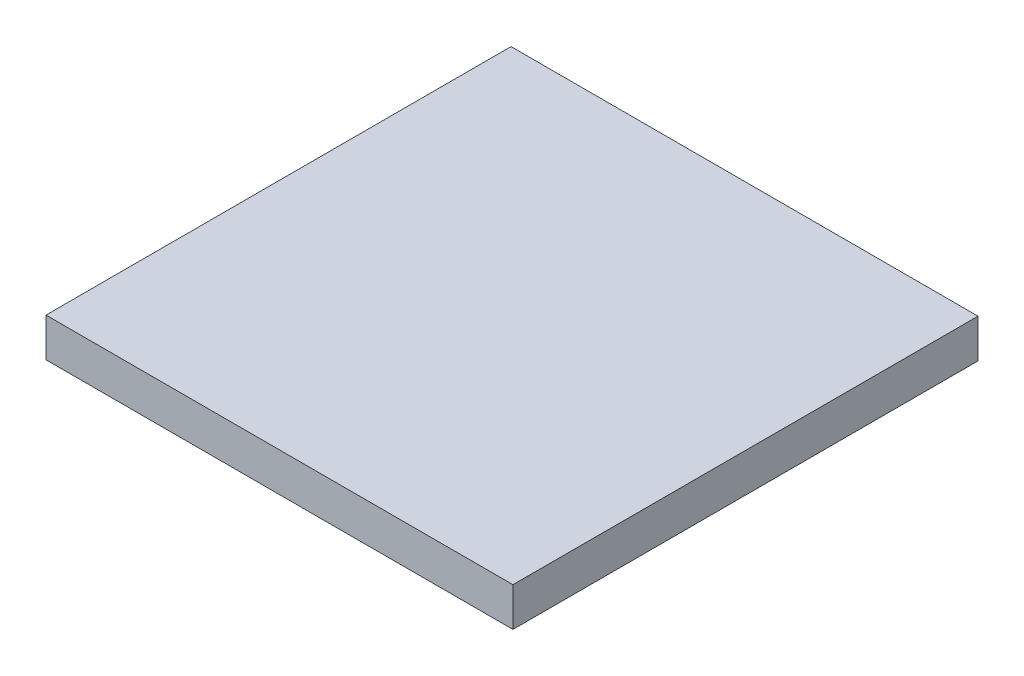
ISO-10303-21;
HEADER;
FILE_DESCRIPTION(('STEP AP214'),'2;1');
FILE_NAME('part.step','',(''),(''),'','','');
FILE_SCHEMA(('AUTOMOTIVE_DESIGN { 1 0 10303 214 1 1 1 1 }'));
ENDSEC;
DATA;
#1=APPLICATION_CONTEXT('core data for automotive mechanical design processes');
#2=APPLICATION_PROTOCOL_DEFINITION('international standard','automotive_design',2000,#1);
#3=PRODUCT_CONTEXT('',#1,'mechanical');
#4=PRODUCT('Part','Part','',(#3));
#5=PRODUCT_RELATED_PRODUCT_CATEGORY('part','',(#4));
#6=PRODUCT_DEFINITION_FORMATION('','',#4);
#7=PRODUCT_DEFINITION_CONTEXT('part definition',#1,'design');
#8=PRODUCT_DEFINITION('design','',#6,#7);
#9=PRODUCT_DEFINITION_SHAPE('','',#8);
#10=(LENGTH_UNIT() NAMED_UNIT(*) SI_UNIT(.MILLI.,.METRE.));
#11=(NAMED_UNIT(*) PLANE_ANGLE_UNIT() SI_UNIT($,.RADIAN.));
#12=(NAMED_UNIT(*) SI_UNIT($,.STERADIAN.) SOLID_ANGLE_UNIT());
#13=UNCERTAINTY_MEASURE_WITH_UNIT(LENGTH_MEASURE(1.E-05),#10,'distance_accuracy_value','');
#14=(GEOMETRIC_REPRESENTATION_CONTEXT(3) GLOBAL_UNCERTAINTY_ASSIGNED_CONTEXT((#13)) GLOBAL_UNIT_ASSIGNED_CONTEXT((#10,
#11,#12)) REPRESENTATION_CONTEXT('',''));
#15=CARTESIAN_POINT('',(0.,0.,0.));
#16=DIRECTION('',(0.,0.,1.));
#17=DIRECTION('',(1.,0.,0.));
#18=AXIS2_PLACEMENT_3D('',#15,#16,#17);
#19=CARTESIAN_POINT('',(153.02484,-12.7,-304.8));
#20=DIRECTION('',(1.,0.,0.));
#21=DIRECTION('',(0.,0.,-1.));
#22=AXIS2_PLACEMENT_3D('',#19,#20,#21);
#23=PLANE('',#22);
#24=DIRECTION('',(0.,1.,0.));
#25=VECTOR('',#24,1.);
#26=CARTESIAN_POINT('',(153.02484,-12.7,0.));
#27=LINE('',#26,#25);
#28=CARTESIAN_POINT('',(153.02484,-12.7,0.));
#29=VERTEX_POINT('',#28);
#30=CARTESIAN_POINT('',(153.02484,12.7,0.));
#31=VERTEX_POINT('',#30);
#32=EDGE_CURVE('E105',#29,#31,#27,.T.);
#33=ORIENTED_EDGE('',*,*,#32,.F.);
#34=DIRECTION('',(0.,0.,1.));
#35=VECTOR('',#34,1.);
#36=CARTESIAN_POINT('',(153.02484,-12.7,-304.8));
#37=LINE('',#36,#35);
#38=CARTESIAN_POINT('',(153.02484,-12.7,-304.8));
#39=VERTEX_POINT('',#38);
#40=EDGE_CURVE('E11',#39,#29,#37,.T.);
#41=ORIENTED_EDGE('',*,*,#40,.F.);
#42=DIRECTION('',(0.,1.,0.));
#43=VECTOR('',#42,1.);
#44=CARTESIAN_POINT('',(153.02484,-12.7,-304.8));
#45=LINE('',#44,#43);
#46=CARTESIAN_POINT('',(153.02484,12.7,-304.8));
#47=VERTEX_POINT('',#46);
#48=EDGE_CURVE('E99',#39,#47,#45,.T.);
#49=ORIENTED_EDGE('',*,*,#48,.T.);
#50=DIRECTION('',(0.,0.,1.));
#51=VECTOR('',#50,1.);
#52=CARTESIAN_POINT('',(153.02484,12.7,-304.8));
#53=LINE('',#52,#51);
#54=EDGE_CURVE('E44',#47,#31,#53,.T.);
#55=ORIENTED_EDGE('',*,*,#54,.T.);
#56=EDGE_LOOP('',(#33,#41,#49,#55));
#57=FACE_BOUND('',#56,.T.);
#58=ADVANCED_FACE('F41',(#57),#23,.T.);
#59=CARTESIAN_POINT('',(-153.02484,-12.7,-304.8));
#60=DIRECTION('',(0.,-1.,0.));
#61=DIRECTION('',(0.,0.,-1.));
#62=AXIS2_PLACEMENT_3D('',#59,#60,#61);
#63=PLANE('',#62);
#64=DIRECTION('',(1.,0.,0.));
#65=VECTOR('',#64,1.);
#66=CARTESIAN_POINT('',(-153.02484,-12.7,0.));
#67=LINE('',#66,#65);
#68=CARTESIAN_POINT('',(-153.02484,-12.7,0.));
#69=VERTEX_POINT('',#68);
#70=EDGE_CURVE('E101',#69,#29,#67,.T.);
#71=ORIENTED_EDGE('',*,*,#70,.F.);
#72=DIRECTION('',(0.,0.,1.));
#73=VECTOR('',#72,1.);
#74=CARTESIAN_POINT('',(-153.02484,-12.7,-304.8));
#75=LINE('',#74,#73);
#76=CARTESIAN_POINT('',(-153.02484,-12.7,-304.8));
#77=VERTEX_POINT('',#76);
#78=EDGE_CURVE('E50',#77,#69,#75,.T.);
#79=ORIENTED_EDGE('',*,*,#78,.F.);
#80=DIRECTION('',(1.,0.,0.));
#81=VECTOR('',#80,1.);
#82=CARTESIAN_POINT('',(-153.02484,-12.7,-304.8));
#83=LINE('',#82,#81);
#84=EDGE_CURVE('E96',#77,#39,#83,.T.);
#85=ORIENTED_EDGE('',*,*,#84,.T.);
#86=ORIENTED_EDGE('',*,*,#40,.T.);
#87=EDGE_LOOP('',(#71,#79,#85,#86));
#88=FACE_BOUND('',#87,.T.);
#89=ADVANCED_FACE('F115',(#88),#63,.T.);
#90=CARTESIAN_POINT('',(-153.02484,-12.7,-304.8));
#91=DIRECTION('',(-1.,0.,0.));
#92=DIRECTION('',(0.,0.,1.));
#93=AXIS2_PLACEMENT_3D('',#90,#91,#92);
#94=PLANE('',#93);
#95=DIRECTION('',(0.,-1.,0.));
#96=VECTOR('',#95,1.);
#97=CARTESIAN_POINT('',(-153.02484,-12.7,0.));
#98=LINE('',#97,#96);
#99=CARTESIAN_POINT('',(-153.02484,12.7,0.));
#100=VERTEX_POINT('',#99);
#101=EDGE_CURVE('E91',#100,#69,#98,.T.);
#102=ORIENTED_EDGE('',*,*,#101,.F.);
#103=DIRECTION('',(0.,0.,1.));
#104=VECTOR('',#103,1.);
#105=CARTESIAN_POINT('',(-153.02484,12.7,-304.8));
#106=LINE('',#105,#104);
#107=CARTESIAN_POINT('',(-153.02484,12.7,-304.8));
#108=VERTEX_POINT('',#107);
#109=EDGE_CURVE('E86',#108,#100,#106,.T.);
#110=ORIENTED_EDGE('',*,*,#109,.F.);
#111=DIRECTION('',(0.,-1.,0.));
#112=VECTOR('',#111,1.);
#113=CARTESIAN_POINT('',(-153.02484,-12.7,-304.8));
#114=LINE('',#113,#112);
#115=EDGE_CURVE('E89',#108,#77,#114,.T.);
#116=ORIENTED_EDGE('',*,*,#115,.T.);
#117=ORIENTED_EDGE('',*,*,#78,.T.);
#118=EDGE_LOOP('',(#102,#110,#116,#117));
#119=FACE_BOUND('',#118,.T.);
#120=ADVANCED_FACE('F88',(#119),#94,.T.);
#121=CARTESIAN_POINT('',(-153.02484,12.7,-304.8));
#122=DIRECTION('',(0.,1.,0.));
#123=DIRECTION('',(0.,0.,1.));
#124=AXIS2_PLACEMENT_3D('',#121,#122,#123);
#125=PLANE('',#124);
#126=DIRECTION('',(-1.,0.,0.));
#127=VECTOR('',#126,1.);
#128=CARTESIAN_POINT('',(-153.02484,12.7,0.));
#129=LINE('',#128,#127);
#130=EDGE_CURVE('E108',#31,#100,#129,.T.);
#131=ORIENTED_EDGE('',*,*,#130,.F.);
#132=ORIENTED_EDGE('',*,*,#54,.F.);
#133=DIRECTION('',(-1.,0.,0.));
#134=VECTOR('',#133,1.);
#135=CARTESIAN_POINT('',(-153.02484,12.7,-304.8));
#136=LINE('',#135,#134);
#137=EDGE_CURVE('E95',#47,#108,#136,.T.);
#138=ORIENTED_EDGE('',*,*,#137,.T.);
#139=ORIENTED_EDGE('',*,*,#109,.T.);
#140=EDGE_LOOP('',(#131,#132,#138,#139));
#141=FACE_BOUND('',#140,.T.);
#142=ADVANCED_FACE('F98',(#141),#125,.T.);
#143=CARTESIAN_POINT('',(0.,0.,-304.8));
#144=DIRECTION('',(0.,0.,-1.));
#145=DIRECTION('',(-1.,0.,0.));
#146=AXIS2_PLACEMENT_3D('',#143,#144,#145);
#147=PLANE('',#146);
#148=ORIENTED_EDGE('',*,*,#48,.F.);
#149=ORIENTED_EDGE('',*,*,#84,.F.);
#150=ORIENTED_EDGE('',*,*,#115,.F.);
#151=ORIENTED_EDGE('',*,*,#137,.F.);
#152=EDGE_LOOP('',(#148,#149,#150,#151));
#153=FACE_BOUND('',#152,.T.);
#154=ADVANCED_FACE('F94',(#153),#147,.T.);
#155=CARTESIAN_POINT('',(0.,0.,0.));
#156=DIRECTION('',(0.,0.,-1.));
#157=DIRECTION('',(-1.,0.,0.));
#158=AXIS2_PLACEMENT_3D('',#155,#156,#157);
#159=PLANE('',#158);
#160=ORIENTED_EDGE('',*,*,#32,.T.);
#161=ORIENTED_EDGE('',*,*,#130,.T.);
#162=ORIENTED_EDGE('',*,*,#101,.T.);
#163=ORIENTED_EDGE('',*,*,#70,.T.);
#164=EDGE_LOOP('',(#160,#161,#162,#163));
#165=FACE_BOUND('',#164,.T.);
#166=ADVANCED_FACE('F114',(#165),#159,.F.);
#167=CLOSED_SHELL('',(#58,#89,#120,#142,#154,#166));
#168=MANIFOLD_SOLID_BREP('B2',#167);
#169=ADVANCED_BREP_SHAPE_REPRESENTATION('',(#18,#168),#14);
#170=SHAPE_DEFINITION_REPRESENTATION(#9,#169);
ENDSEC;
END-ISO-10303-21;
